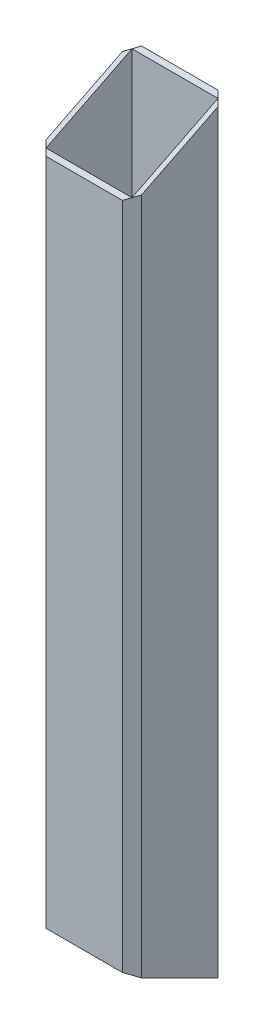
ISO-10303-21;
HEADER;
FILE_DESCRIPTION(('STEP AP214'),'2;1');
FILE_NAME('part.step','',(''),(''),'','','');
FILE_SCHEMA(('AUTOMOTIVE_DESIGN { 1 0 10303 214 1 1 1 1 }'));
ENDSEC;
DATA;
#1=APPLICATION_CONTEXT('core data for automotive mechanical design processes');
#2=APPLICATION_PROTOCOL_DEFINITION('international standard','automotive_design',2000,#1);
#3=PRODUCT_CONTEXT('',#1,'mechanical');
#4=PRODUCT('Part','Part','',(#3));
#5=PRODUCT_RELATED_PRODUCT_CATEGORY('part','',(#4));
#6=PRODUCT_DEFINITION_FORMATION('','',#4);
#7=PRODUCT_DEFINITION_CONTEXT('part definition',#1,'design');
#8=PRODUCT_DEFINITION('design','',#6,#7);
#9=PRODUCT_DEFINITION_SHAPE('','',#8);
#10=(LENGTH_UNIT() NAMED_UNIT(*) SI_UNIT(.MILLI.,.METRE.));
#11=(NAMED_UNIT(*) PLANE_ANGLE_UNIT() SI_UNIT($,.RADIAN.));
#12=(NAMED_UNIT(*) SI_UNIT($,.STERADIAN.) SOLID_ANGLE_UNIT());
#13=UNCERTAINTY_MEASURE_WITH_UNIT(LENGTH_MEASURE(1.E-05),#10,'distance_accuracy_value','');
#14=(GEOMETRIC_REPRESENTATION_CONTEXT(3) GLOBAL_UNCERTAINTY_ASSIGNED_CONTEXT((#13)) GLOBAL_UNIT_ASSIGNED_CONTEXT((#10,
#11,#12)) REPRESENTATION_CONTEXT('',''));
#15=CARTESIAN_POINT('',(0.,0.,0.));
#16=DIRECTION('',(0.,0.,1.));
#17=DIRECTION('',(1.,0.,0.));
#18=AXIS2_PLACEMENT_3D('',#15,#16,#17);
#19=CARTESIAN_POINT('',(50.,375.,50.));
#20=DIRECTION('',(0.,0.894427190999916,0.447213595499958));
#21=DIRECTION('',(0.,-0.447213595499958,0.894427190999916));
#22=AXIS2_PLACEMENT_3D('',#19,#20,#21);
#23=PLANE('',#22);
#24=DIRECTION('',(-1.,0.,0.));
#25=VECTOR('',#24,1.);
#26=CARTESIAN_POINT('',(0.,400.,0.));
#27=LINE('',#26,#25);
#28=CARTESIAN_POINT('',(45.,400.,0.));
#29=VERTEX_POINT('',#28);
#30=CARTESIAN_POINT('',(5.,400.,0.));
#31=VERTEX_POINT('',#30);
#32=EDGE_CURVE('E167',#29,#31,#27,.T.);
#33=ORIENTED_EDGE('',*,*,#32,.T.);
#34=DIRECTION('',(-0.666666666666667,-0.333333333333334,0.666666666666667));
#35=VECTOR('',#34,1.);
#36=CARTESIAN_POINT('',(-2.77777777777778,396.111111111111,7.77777777777779));
#37=LINE('',#36,#35);
#38=CARTESIAN_POINT('',(2.5,398.75,2.5));
#39=VERTEX_POINT('',#38);
#40=EDGE_CURVE('E232',#31,#39,#37,.T.);
#41=ORIENTED_EDGE('',*,*,#40,.T.);
#42=DIRECTION('',(1.,0.,0.));
#43=VECTOR('',#42,1.);
#44=CARTESIAN_POINT('',(47.5,398.75,2.5));
#45=LINE('',#44,#43);
#46=CARTESIAN_POINT('',(47.5,398.75,2.49999999999999));
#47=VERTEX_POINT('',#46);
#48=EDGE_CURVE('E186',#39,#47,#45,.T.);
#49=ORIENTED_EDGE('',*,*,#48,.T.);
#50=DIRECTION('',(-0.666666666666667,0.333333333333334,-0.666666666666667));
#51=VECTOR('',#50,1.);
#52=CARTESIAN_POINT('',(75.,385.,30.));
#53=LINE('',#52,#51);
#54=EDGE_CURVE('E218',#47,#29,#53,.T.);
#55=ORIENTED_EDGE('',*,*,#54,.T.);
#56=EDGE_LOOP('',(#33,#41,#49,#55));
#57=FACE_BOUND('',#56,.T.);
#58=ADVANCED_FACE('F44',(#57),#23,.T.);
#59=DIRECTION('',(0.,0.447213595499958,-0.894427190999916));
#60=VECTOR('',#59,1.);
#61=CARTESIAN_POINT('',(2.5,381.,38.));
#62=LINE('',#61,#60);
#63=CARTESIAN_POINT('',(2.5,376.25,47.5));
#64=VERTEX_POINT('',#63);
#65=EDGE_CURVE('E285',#64,#39,#62,.T.);
#66=ORIENTED_EDGE('',*,*,#65,.T.);
#67=DIRECTION('',(-0.666666666666667,-0.333333333333334,0.666666666666667));
#68=VECTOR('',#67,1.);
#69=CARTESIAN_POINT('',(-2.77777777777778,396.111111111111,7.77777777777779));
#70=LINE('',#69,#68);
#71=CARTESIAN_POINT('',(0.,397.5,5.));
#72=VERTEX_POINT('',#71);
#73=EDGE_CURVE('E229',#39,#72,#70,.T.);
#74=ORIENTED_EDGE('',*,*,#73,.T.);
#75=DIRECTION('',(0.,0.447213595499958,-0.894427190999916));
#76=VECTOR('',#75,1.);
#77=CARTESIAN_POINT('',(0.,375.,50.));
#78=LINE('',#77,#76);
#79=CARTESIAN_POINT('',(0.,377.5,45.));
#80=VERTEX_POINT('',#79);
#81=EDGE_CURVE('E302',#80,#72,#78,.T.);
#82=ORIENTED_EDGE('',*,*,#81,.F.);
#83=DIRECTION('',(-0.666666666666667,0.333333333333334,-0.666666666666667));
#84=VECTOR('',#83,1.);
#85=CARTESIAN_POINT('',(25.,365.,70.));
#86=LINE('',#85,#84);
#87=EDGE_CURVE('E226',#80,#64,#86,.F.);
#88=ORIENTED_EDGE('',*,*,#87,.T.);
#89=EDGE_LOOP('',(#66,#74,#82,#88));
#90=FACE_BOUND('',#89,.T.);
#91=ADVANCED_FACE('F329',(#90),#23,.T.);
#92=DIRECTION('',(0.,0.447213595499958,-0.894427190999916));
#93=VECTOR('',#92,1.);
#94=CARTESIAN_POINT('',(50.,375.,50.));
#95=LINE('',#94,#93);
#96=CARTESIAN_POINT('',(50.,377.5,45.));
#97=VERTEX_POINT('',#96);
#98=CARTESIAN_POINT('',(50.,397.5,5.));
#99=VERTEX_POINT('',#98);
#100=EDGE_CURVE('E247',#97,#99,#95,.T.);
#101=ORIENTED_EDGE('',*,*,#100,.T.);
#102=DIRECTION('',(-0.666666666666667,0.333333333333334,-0.666666666666667));
#103=VECTOR('',#102,1.);
#104=CARTESIAN_POINT('',(75.,385.,30.));
#105=LINE('',#104,#103);
#106=EDGE_CURVE('E61',#99,#47,#105,.T.);
#107=ORIENTED_EDGE('',*,*,#106,.T.);
#108=DIRECTION('',(0.,-0.447213595499958,0.894427190999916));
#109=VECTOR('',#108,1.);
#110=CARTESIAN_POINT('',(47.5,381.,38.));
#111=LINE('',#110,#109);
#112=CARTESIAN_POINT('',(47.5,376.25,47.5));
#113=VERTEX_POINT('',#112);
#114=EDGE_CURVE('E166',#47,#113,#111,.T.);
#115=ORIENTED_EDGE('',*,*,#114,.T.);
#116=DIRECTION('',(-0.666666666666667,-0.333333333333334,0.666666666666667));
#117=VECTOR('',#116,1.);
#118=CARTESIAN_POINT('',(47.2222222222222,376.111111111111,47.7777777777778));
#119=LINE('',#118,#117);
#120=EDGE_CURVE('E68',#113,#97,#119,.F.);
#121=ORIENTED_EDGE('',*,*,#120,.T.);
#122=EDGE_LOOP('',(#101,#107,#115,#121));
#123=FACE_BOUND('',#122,.T.);
#124=ADVANCED_FACE('F312',(#123),#23,.T.);
#125=CARTESIAN_POINT('',(50.,25.,50.));
#126=DIRECTION('',(0.,0.894427190999916,-0.447213595499958));
#127=DIRECTION('',(0.,0.447213595499958,0.894427190999916));
#128=AXIS2_PLACEMENT_3D('',#125,#126,#127);
#129=PLANE('',#128);
#130=DIRECTION('',(0.,-0.447213595499958,-0.894427190999916));
#131=VECTOR('',#130,1.);
#132=CARTESIAN_POINT('',(0.,25.,50.));
#133=LINE('',#132,#131);
#134=CARTESIAN_POINT('',(0.,22.5,45.));
#135=VERTEX_POINT('',#134);
#136=CARTESIAN_POINT('',(0.,2.50000000000001,5.00000000000002));
#137=VERTEX_POINT('',#136);
#138=EDGE_CURVE('E250',#135,#137,#133,.T.);
#139=ORIENTED_EDGE('',*,*,#138,.T.);
#140=DIRECTION('',(0.666666666666667,-0.333333333333333,-0.666666666666667));
#141=VECTOR('',#140,1.);
#142=CARTESIAN_POINT('',(0.555555555555556,2.22222222222222,4.44444444444445));
#143=LINE('',#142,#141);
#144=CARTESIAN_POINT('',(2.5,1.25000000000003,2.5));
#145=VERTEX_POINT('',#144);
#146=EDGE_CURVE('E204',#137,#145,#143,.T.);
#147=ORIENTED_EDGE('',*,*,#146,.T.);
#148=DIRECTION('',(0.,-0.447213595499958,-0.894427190999916));
#149=VECTOR('',#148,1.);
#150=CARTESIAN_POINT('',(2.5,99.,198.));
#151=LINE('',#150,#149);
#152=CARTESIAN_POINT('',(2.5,23.75,47.5));
#153=VERTEX_POINT('',#152);
#154=EDGE_CURVE('E180',#153,#145,#151,.T.);
#155=ORIENTED_EDGE('',*,*,#154,.F.);
#156=DIRECTION('',(0.666666666666667,0.333333333333333,0.666666666666667));
#157=VECTOR('',#156,1.);
#158=CARTESIAN_POINT('',(-0.555555555555551,22.2222222222222,44.4444444444444));
#159=LINE('',#158,#157);
#160=EDGE_CURVE('E149',#153,#135,#159,.F.);
#161=ORIENTED_EDGE('',*,*,#160,.T.);
#162=EDGE_LOOP('',(#139,#147,#155,#161));
#163=FACE_BOUND('',#162,.T.);
#164=ADVANCED_FACE('F349',(#163),#129,.F.);
#165=DIRECTION('',(-1.,0.,0.));
#166=VECTOR('',#165,1.);
#167=CARTESIAN_POINT('',(50.,25.,50.));
#168=LINE('',#167,#166);
#169=CARTESIAN_POINT('',(45.,25.,50.));
#170=VERTEX_POINT('',#169);
#171=CARTESIAN_POINT('',(5.,25.,50.));
#172=VERTEX_POINT('',#171);
#173=EDGE_CURVE('E251',#170,#172,#168,.T.);
#174=ORIENTED_EDGE('',*,*,#173,.T.);
#175=DIRECTION('',(0.666666666666667,0.333333333333333,0.666666666666667));
#176=VECTOR('',#175,1.);
#177=CARTESIAN_POINT('',(-0.555555555555551,22.2222222222222,44.4444444444444));
#178=LINE('',#177,#176);
#179=EDGE_CURVE('E198',#172,#153,#178,.F.);
#180=ORIENTED_EDGE('',*,*,#179,.T.);
#181=DIRECTION('',(-1.,0.,0.));
#182=VECTOR('',#181,1.);
#183=CARTESIAN_POINT('',(2.5,23.75,47.5));
#184=LINE('',#183,#182);
#185=CARTESIAN_POINT('',(47.5,23.75,47.5));
#186=VERTEX_POINT('',#185);
#187=EDGE_CURVE('E294',#186,#153,#184,.T.);
#188=ORIENTED_EDGE('',*,*,#187,.F.);
#189=DIRECTION('',(0.666666666666667,-0.333333333333333,-0.666666666666667));
#190=VECTOR('',#189,1.);
#191=CARTESIAN_POINT('',(50.5555555555556,22.2222222222222,44.4444444444444));
#192=LINE('',#191,#190);
#193=EDGE_CURVE('E192',#186,#170,#192,.F.);
#194=ORIENTED_EDGE('',*,*,#193,.T.);
#195=EDGE_LOOP('',(#174,#180,#188,#194));
#196=FACE_BOUND('',#195,.T.);
#197=ADVANCED_FACE('F347',(#196),#129,.F.);
#198=DIRECTION('',(1.,0.,0.));
#199=VECTOR('',#198,1.);
#200=CARTESIAN_POINT('',(47.5,1.25000000000003,2.5));
#201=LINE('',#200,#199);
#202=CARTESIAN_POINT('',(47.5,1.25000000000003,2.5));
#203=VERTEX_POINT('',#202);
#204=EDGE_CURVE('E142',#145,#203,#201,.T.);
#205=ORIENTED_EDGE('',*,*,#204,.F.);
#206=DIRECTION('',(0.666666666666667,-0.333333333333333,-0.666666666666667));
#207=VECTOR('',#206,1.);
#208=CARTESIAN_POINT('',(0.555555555555556,2.22222222222222,4.44444444444445));
#209=LINE('',#208,#207);
#210=CARTESIAN_POINT('',(5.,0.,0.));
#211=VERTEX_POINT('',#210);
#212=EDGE_CURVE('E201',#145,#211,#209,.T.);
#213=ORIENTED_EDGE('',*,*,#212,.T.);
#214=DIRECTION('',(1.,0.,0.));
#215=VECTOR('',#214,1.);
#216=CARTESIAN_POINT('',(0.,0.,0.));
#217=LINE('',#216,#215);
#218=CARTESIAN_POINT('',(45.,0.,0.));
#219=VERTEX_POINT('',#218);
#220=EDGE_CURVE('E145',#211,#219,#217,.T.);
#221=ORIENTED_EDGE('',*,*,#220,.T.);
#222=DIRECTION('',(0.666666666666667,0.333333333333333,0.666666666666667));
#223=VECTOR('',#222,1.);
#224=CARTESIAN_POINT('',(49.4444444444444,2.22222222222222,4.44444444444445));
#225=LINE('',#224,#223);
#226=EDGE_CURVE('E138',#219,#203,#225,.T.);
#227=ORIENTED_EDGE('',*,*,#226,.T.);
#228=EDGE_LOOP('',(#205,#213,#221,#227));
#229=FACE_BOUND('',#228,.T.);
#230=ADVANCED_FACE('F140',(#229),#129,.F.);
#231=CARTESIAN_POINT('',(47.5,400.,47.5));
#232=DIRECTION('',(1.,0.,0.));
#233=DIRECTION('',(0.,0.,-1.));
#234=AXIS2_PLACEMENT_3D('',#231,#232,#233);
#235=PLANE('',#234);
#236=ORIENTED_EDGE('',*,*,#114,.F.);
#237=DIRECTION('',(0.,-1.,0.));
#238=VECTOR('',#237,1.);
#239=CARTESIAN_POINT('',(47.5,400.,2.5));
#240=LINE('',#239,#238);
#241=EDGE_CURVE('E174',#47,#203,#240,.T.);
#242=ORIENTED_EDGE('',*,*,#241,.T.);
#243=DIRECTION('',(0.,0.447213595499958,0.894427190999916));
#244=VECTOR('',#243,1.);
#245=CARTESIAN_POINT('',(47.5,99.,198.));
#246=LINE('',#245,#244);
#247=EDGE_CURVE('E154',#203,#186,#246,.T.);
#248=ORIENTED_EDGE('',*,*,#247,.T.);
#249=DIRECTION('',(0.,-1.,0.));
#250=VECTOR('',#249,1.);
#251=CARTESIAN_POINT('',(47.5,400.,47.5));
#252=LINE('',#251,#250);
#253=EDGE_CURVE('E185',#113,#186,#252,.T.);
#254=ORIENTED_EDGE('',*,*,#253,.F.);
#255=EDGE_LOOP('',(#236,#242,#248,#254));
#256=FACE_BOUND('',#255,.T.);
#257=ADVANCED_FACE('F183',(#256),#235,.F.);
#258=CARTESIAN_POINT('',(2.5,400.,47.5));
#259=DIRECTION('',(0.,0.,1.));
#260=DIRECTION('',(1.,0.,0.));
#261=AXIS2_PLACEMENT_3D('',#258,#259,#260);
#262=PLANE('',#261);
#263=DIRECTION('',(-1.,0.,0.));
#264=VECTOR('',#263,1.);
#265=CARTESIAN_POINT('',(2.5,376.25,47.5));
#266=LINE('',#265,#264);
#267=EDGE_CURVE('E179',#113,#64,#266,.T.);
#268=ORIENTED_EDGE('',*,*,#267,.F.);
#269=ORIENTED_EDGE('',*,*,#253,.T.);
#270=ORIENTED_EDGE('',*,*,#187,.T.);
#271=DIRECTION('',(0.,-1.,0.));
#272=VECTOR('',#271,1.);
#273=CARTESIAN_POINT('',(2.5,400.,47.5));
#274=LINE('',#273,#272);
#275=EDGE_CURVE('E276',#64,#153,#274,.T.);
#276=ORIENTED_EDGE('',*,*,#275,.F.);
#277=EDGE_LOOP('',(#268,#269,#270,#276));
#278=FACE_BOUND('',#277,.T.);
#279=ADVANCED_FACE('F344',(#278),#262,.F.);
#280=CARTESIAN_POINT('',(2.5,400.,47.5));
#281=DIRECTION('',(-1.,0.,0.));
#282=DIRECTION('',(0.,0.,1.));
#283=AXIS2_PLACEMENT_3D('',#280,#281,#282);
#284=PLANE('',#283);
#285=ORIENTED_EDGE('',*,*,#65,.F.);
#286=ORIENTED_EDGE('',*,*,#275,.T.);
#287=ORIENTED_EDGE('',*,*,#154,.T.);
#288=DIRECTION('',(0.,-1.,0.));
#289=VECTOR('',#288,1.);
#290=CARTESIAN_POINT('',(2.5,400.,2.5));
#291=LINE('',#290,#289);
#292=EDGE_CURVE('E176',#39,#145,#291,.T.);
#293=ORIENTED_EDGE('',*,*,#292,.F.);
#294=EDGE_LOOP('',(#285,#286,#287,#293));
#295=FACE_BOUND('',#294,.T.);
#296=ADVANCED_FACE('F320',(#295),#284,.F.);
#297=CARTESIAN_POINT('',(47.5,400.,2.5));
#298=DIRECTION('',(0.,0.,-1.));
#299=DIRECTION('',(-1.,0.,0.));
#300=AXIS2_PLACEMENT_3D('',#297,#298,#299);
#301=PLANE('',#300);
#302=ORIENTED_EDGE('',*,*,#48,.F.);
#303=ORIENTED_EDGE('',*,*,#292,.T.);
#304=ORIENTED_EDGE('',*,*,#204,.T.);
#305=ORIENTED_EDGE('',*,*,#241,.F.);
#306=EDGE_LOOP('',(#302,#303,#304,#305));
#307=FACE_BOUND('',#306,.T.);
#308=ADVANCED_FACE('F173',(#307),#301,.F.);
#309=ORIENTED_EDGE('',*,*,#247,.F.);
#310=DIRECTION('',(0.666666666666667,0.333333333333333,0.666666666666667));
#311=VECTOR('',#310,1.);
#312=CARTESIAN_POINT('',(49.4444444444444,2.22222222222222,4.44444444444445));
#313=LINE('',#312,#311);
#314=CARTESIAN_POINT('',(50.,2.50000000000001,5.00000000000002));
#315=VERTEX_POINT('',#314);
#316=EDGE_CURVE('E150',#203,#315,#313,.T.);
#317=ORIENTED_EDGE('',*,*,#316,.T.);
#318=DIRECTION('',(0.,-0.447213595499958,-0.894427190999916));
#319=VECTOR('',#318,1.);
#320=CARTESIAN_POINT('',(50.,25.,50.));
#321=LINE('',#320,#319);
#322=CARTESIAN_POINT('',(50.,22.5,45.));
#323=VERTEX_POINT('',#322);
#324=EDGE_CURVE('E246',#323,#315,#321,.T.);
#325=ORIENTED_EDGE('',*,*,#324,.F.);
#326=DIRECTION('',(0.666666666666667,-0.333333333333333,-0.666666666666667));
#327=VECTOR('',#326,1.);
#328=CARTESIAN_POINT('',(50.5555555555556,22.2222222222222,44.4444444444444));
#329=LINE('',#328,#327);
#330=EDGE_CURVE('E159',#323,#186,#329,.F.);
#331=ORIENTED_EDGE('',*,*,#330,.T.);
#332=EDGE_LOOP('',(#309,#317,#325,#331));
#333=FACE_BOUND('',#332,.T.);
#334=ADVANCED_FACE('F155',(#333),#129,.F.);
#335=ORIENTED_EDGE('',*,*,#267,.T.);
#336=DIRECTION('',(-0.666666666666667,0.333333333333334,-0.666666666666667));
#337=VECTOR('',#336,1.);
#338=CARTESIAN_POINT('',(25.,365.,70.));
#339=LINE('',#338,#337);
#340=CARTESIAN_POINT('',(5.,375.,50.));
#341=VERTEX_POINT('',#340);
#342=EDGE_CURVE('E223',#64,#341,#339,.F.);
#343=ORIENTED_EDGE('',*,*,#342,.T.);
#344=DIRECTION('',(-1.,0.,0.));
#345=VECTOR('',#344,1.);
#346=CARTESIAN_POINT('',(50.,375.,50.));
#347=LINE('',#346,#345);
#348=CARTESIAN_POINT('',(45.,375.,50.));
#349=VERTEX_POINT('',#348);
#350=EDGE_CURVE('E297',#349,#341,#347,.T.);
#351=ORIENTED_EDGE('',*,*,#350,.F.);
#352=DIRECTION('',(-0.666666666666667,-0.333333333333334,0.666666666666667));
#353=VECTOR('',#352,1.);
#354=CARTESIAN_POINT('',(47.2222222222222,376.111111111111,47.7777777777778));
#355=LINE('',#354,#353);
#356=EDGE_CURVE('E215',#349,#113,#355,.F.);
#357=ORIENTED_EDGE('',*,*,#356,.T.);
#358=EDGE_LOOP('',(#335,#343,#351,#357));
#359=FACE_BOUND('',#358,.T.);
#360=ADVANCED_FACE('F341',(#359),#23,.T.);
#361=CARTESIAN_POINT('',(0.,0.,50.));
#362=DIRECTION('',(1.,0.,0.));
#363=DIRECTION('',(0.,0.,-1.));
#364=AXIS2_PLACEMENT_3D('',#361,#362,#363);
#365=PLANE('',#364);
#366=ORIENTED_EDGE('',*,*,#81,.T.);
#367=DIRECTION('',(0.,-1.,0.));
#368=VECTOR('',#367,1.);
#369=CARTESIAN_POINT('',(0.,0.,5.));
#370=LINE('',#369,#368);
#371=EDGE_CURVE('E259',#72,#137,#370,.T.);
#372=ORIENTED_EDGE('',*,*,#371,.T.);
#373=ORIENTED_EDGE('',*,*,#138,.F.);
#374=DIRECTION('',(0.,1.,0.));
#375=VECTOR('',#374,1.);
#376=CARTESIAN_POINT('',(0.,0.,45.));
#377=LINE('',#376,#375);
#378=EDGE_CURVE('E262',#135,#80,#377,.T.);
#379=ORIENTED_EDGE('',*,*,#378,.T.);
#380=EDGE_LOOP('',(#366,#372,#373,#379));
#381=FACE_BOUND('',#380,.T.);
#382=ADVANCED_FACE('F332',(#381),#365,.F.);
#383=CARTESIAN_POINT('',(50.,0.,50.));
#384=DIRECTION('',(-1.,0.,0.));
#385=DIRECTION('',(0.,0.,1.));
#386=AXIS2_PLACEMENT_3D('',#383,#384,#385);
#387=PLANE('',#386);
#388=ORIENTED_EDGE('',*,*,#324,.T.);
#389=DIRECTION('',(0.,1.,0.));
#390=VECTOR('',#389,1.);
#391=CARTESIAN_POINT('',(50.,400.,5.));
#392=LINE('',#391,#390);
#393=EDGE_CURVE('E11',#315,#99,#392,.T.);
#394=ORIENTED_EDGE('',*,*,#393,.T.);
#395=ORIENTED_EDGE('',*,*,#100,.F.);
#396=DIRECTION('',(0.,-1.,0.));
#397=VECTOR('',#396,1.);
#398=CARTESIAN_POINT('',(50.,0.,45.));
#399=LINE('',#398,#397);
#400=EDGE_CURVE('E54',#97,#323,#399,.T.);
#401=ORIENTED_EDGE('',*,*,#400,.T.);
#402=EDGE_LOOP('',(#388,#394,#395,#401));
#403=FACE_BOUND('',#402,.T.);
#404=ADVANCED_FACE('F245',(#403),#387,.F.);
#405=CARTESIAN_POINT('',(0.,0.,50.));
#406=DIRECTION('',(0.,0.,-1.));
#407=DIRECTION('',(-1.,0.,0.));
#408=AXIS2_PLACEMENT_3D('',#405,#406,#407);
#409=PLANE('',#408);
#410=ORIENTED_EDGE('',*,*,#350,.T.);
#411=DIRECTION('',(0.,-1.,0.));
#412=VECTOR('',#411,1.);
#413=CARTESIAN_POINT('',(5.,0.,50.));
#414=LINE('',#413,#412);
#415=EDGE_CURVE('E239',#341,#172,#414,.T.);
#416=ORIENTED_EDGE('',*,*,#415,.T.);
#417=ORIENTED_EDGE('',*,*,#173,.F.);
#418=DIRECTION('',(0.,1.,0.));
#419=VECTOR('',#418,1.);
#420=CARTESIAN_POINT('',(45.,0.,50.));
#421=LINE('',#420,#419);
#422=EDGE_CURVE('E235',#170,#349,#421,.T.);
#423=ORIENTED_EDGE('',*,*,#422,.T.);
#424=EDGE_LOOP('',(#410,#416,#417,#423));
#425=FACE_BOUND('',#424,.T.);
#426=ADVANCED_FACE('F346',(#425),#409,.F.);
#427=CARTESIAN_POINT('',(0.,0.,0.));
#428=DIRECTION('',(0.,0.,-1.));
#429=DIRECTION('',(-1.,0.,0.));
#430=AXIS2_PLACEMENT_3D('',#427,#428,#429);
#431=PLANE('',#430);
#432=ORIENTED_EDGE('',*,*,#220,.F.);
#433=DIRECTION('',(0.,1.,0.));
#434=VECTOR('',#433,1.);
#435=CARTESIAN_POINT('',(5.,400.,0.));
#436=LINE('',#435,#434);
#437=EDGE_CURVE('E210',#211,#31,#436,.T.);
#438=ORIENTED_EDGE('',*,*,#437,.T.);
#439=ORIENTED_EDGE('',*,*,#32,.F.);
#440=DIRECTION('',(0.,-1.,0.));
#441=VECTOR('',#440,1.);
#442=CARTESIAN_POINT('',(45.,0.,0.));
#443=LINE('',#442,#441);
#444=EDGE_CURVE('E207',#29,#219,#443,.T.);
#445=ORIENTED_EDGE('',*,*,#444,.T.);
#446=EDGE_LOOP('',(#432,#438,#439,#445));
#447=FACE_BOUND('',#446,.T.);
#448=ADVANCED_FACE('F351',(#447),#431,.T.);
#449=CARTESIAN_POINT('',(0.,0.,5.));
#450=DIRECTION('',(-0.707106781186547,0.,-0.707106781186547));
#451=DIRECTION('',(0.,1.,0.));
#452=AXIS2_PLACEMENT_3D('',#449,#450,#451);
#453=PLANE('',#452);
#454=ORIENTED_EDGE('',*,*,#40,.F.);
#455=ORIENTED_EDGE('',*,*,#437,.F.);
#456=ORIENTED_EDGE('',*,*,#212,.F.);
#457=ORIENTED_EDGE('',*,*,#146,.F.);
#458=ORIENTED_EDGE('',*,*,#371,.F.);
#459=ORIENTED_EDGE('',*,*,#73,.F.);
#460=EDGE_LOOP('',(#454,#455,#456,#457,#458,#459));
#461=FACE_BOUND('',#460,.T.);
#462=ADVANCED_FACE('F325',(#461),#453,.T.);
#463=CARTESIAN_POINT('',(5.,0.,50.));
#464=DIRECTION('',(0.707106781186547,0.,-0.707106781186547));
#465=DIRECTION('',(0.,-1.,0.));
#466=AXIS2_PLACEMENT_3D('',#463,#464,#465);
#467=PLANE('',#466);
#468=ORIENTED_EDGE('',*,*,#87,.F.);
#469=ORIENTED_EDGE('',*,*,#378,.F.);
#470=ORIENTED_EDGE('',*,*,#160,.F.);
#471=ORIENTED_EDGE('',*,*,#179,.F.);
#472=ORIENTED_EDGE('',*,*,#415,.F.);
#473=ORIENTED_EDGE('',*,*,#342,.F.);
#474=EDGE_LOOP('',(#468,#469,#470,#471,#472,#473));
#475=FACE_BOUND('',#474,.T.);
#476=ADVANCED_FACE('F337',(#475),#467,.F.);
#477=CARTESIAN_POINT('',(50.,0.,5.));
#478=DIRECTION('',(0.707106781186547,0.,-0.707106781186547));
#479=DIRECTION('',(0.,-1.,0.));
#480=AXIS2_PLACEMENT_3D('',#477,#478,#479);
#481=PLANE('',#480);
#482=ORIENTED_EDGE('',*,*,#226,.F.);
#483=ORIENTED_EDGE('',*,*,#444,.F.);
#484=ORIENTED_EDGE('',*,*,#54,.F.);
#485=ORIENTED_EDGE('',*,*,#106,.F.);
#486=ORIENTED_EDGE('',*,*,#393,.F.);
#487=ORIENTED_EDGE('',*,*,#316,.F.);
#488=EDGE_LOOP('',(#482,#483,#484,#485,#486,#487));
#489=FACE_BOUND('',#488,.T.);
#490=ADVANCED_FACE('F188',(#489),#481,.T.);
#491=CARTESIAN_POINT('',(45.,0.,50.));
#492=DIRECTION('',(-0.707106781186547,0.,-0.707106781186547));
#493=DIRECTION('',(0.,1.,0.));
#494=AXIS2_PLACEMENT_3D('',#491,#492,#493);
#495=PLANE('',#494);
#496=ORIENTED_EDGE('',*,*,#330,.F.);
#497=ORIENTED_EDGE('',*,*,#400,.F.);
#498=ORIENTED_EDGE('',*,*,#120,.F.);
#499=ORIENTED_EDGE('',*,*,#356,.F.);
#500=ORIENTED_EDGE('',*,*,#422,.F.);
#501=ORIENTED_EDGE('',*,*,#193,.F.);
#502=EDGE_LOOP('',(#496,#497,#498,#499,#500,#501));
#503=FACE_BOUND('',#502,.T.);
#504=ADVANCED_FACE('F47',(#503),#495,.F.);
#505=CLOSED_SHELL('',(#58,#91,#124,#164,#197,#230,#257,#279,#296,#308,#334,#360,#382,#404,#426,
#448,#462,#476,#490,#504));
#506=MANIFOLD_SOLID_BREP('B2',#505);
#507=ADVANCED_BREP_SHAPE_REPRESENTATION('',(#18,#506),#14);
#508=SHAPE_DEFINITION_REPRESENTATION(#9,#507);
ENDSEC;
END-ISO-10303-21;
